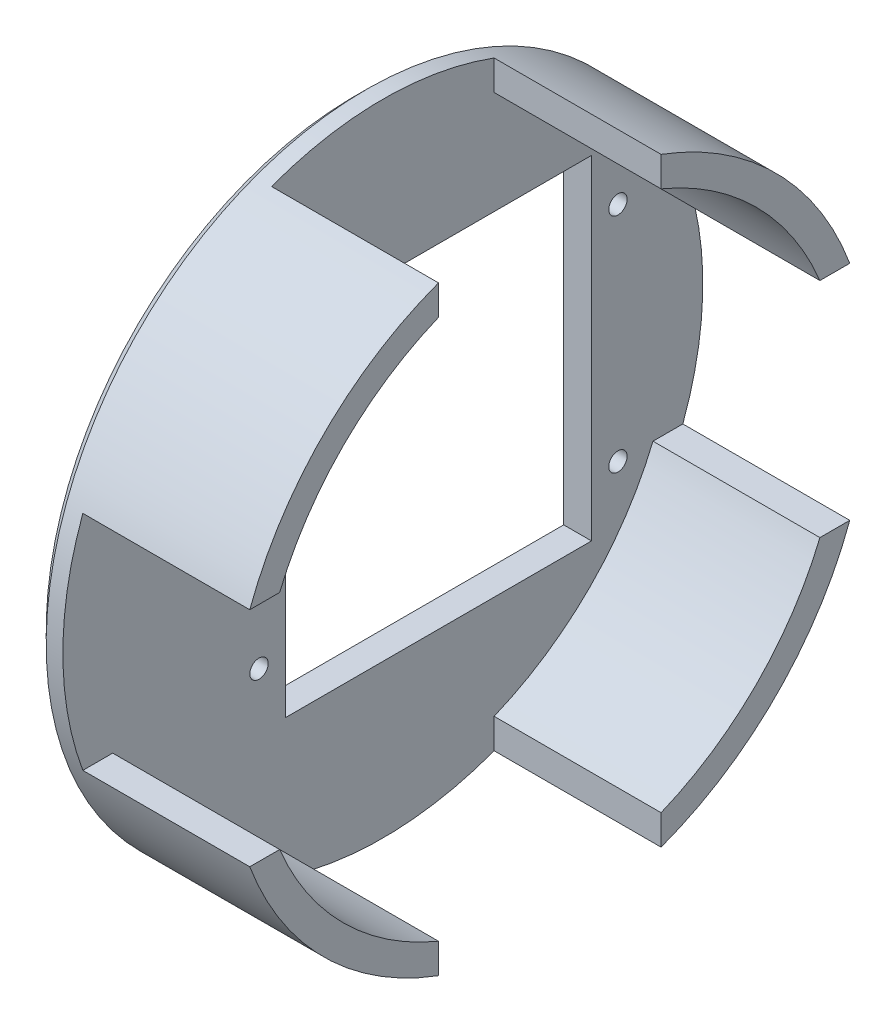
ISO-10303-21;
HEADER;
FILE_DESCRIPTION(('STEP AP214'),'2;1');
FILE_NAME('part.step','',(''),(''),'','','');
FILE_SCHEMA(('AUTOMOTIVE_DESIGN { 1 0 10303 214 1 1 1 1 }'));
ENDSEC;
DATA;
#1=APPLICATION_CONTEXT('core data for automotive mechanical design processes');
#2=APPLICATION_PROTOCOL_DEFINITION('international standard','automotive_design',2000,#1);
#3=PRODUCT_CONTEXT('',#1,'mechanical');
#4=PRODUCT('Part','Part','',(#3));
#5=PRODUCT_RELATED_PRODUCT_CATEGORY('part','',(#4));
#6=PRODUCT_DEFINITION_FORMATION('','',#4);
#7=PRODUCT_DEFINITION_CONTEXT('part definition',#1,'design');
#8=PRODUCT_DEFINITION('design','',#6,#7);
#9=PRODUCT_DEFINITION_SHAPE('','',#8);
#10=(LENGTH_UNIT() NAMED_UNIT(*) SI_UNIT(.MILLI.,.METRE.));
#11=(NAMED_UNIT(*) PLANE_ANGLE_UNIT() SI_UNIT($,.RADIAN.));
#12=(NAMED_UNIT(*) SI_UNIT($,.STERADIAN.) SOLID_ANGLE_UNIT());
#13=UNCERTAINTY_MEASURE_WITH_UNIT(LENGTH_MEASURE(1.E-05),#10,'distance_accuracy_value','');
#14=(GEOMETRIC_REPRESENTATION_CONTEXT(3) GLOBAL_UNCERTAINTY_ASSIGNED_CONTEXT((#13)) GLOBAL_UNIT_ASSIGNED_CONTEXT((#10,
#11,#12)) REPRESENTATION_CONTEXT('',''));
#15=CARTESIAN_POINT('',(0.,0.,0.));
#16=DIRECTION('',(0.,0.,1.));
#17=DIRECTION('',(1.,0.,0.));
#18=AXIS2_PLACEMENT_3D('',#15,#16,#17);
#19=CARTESIAN_POINT('',(5.,0.,0.));
#20=DIRECTION('',(-1.,0.,0.));
#21=DIRECTION('',(0.,0.,1.));
#22=AXIS2_PLACEMENT_3D('',#19,#20,#21);
#23=CYLINDRICAL_SURFACE('',#22,57.5);
#24=CARTESIAN_POINT('',(2.00000000000003,0.,0.));
#25=DIRECTION('',(1.,0.,0.));
#26=DIRECTION('',(0.,0.,-1.));
#27=AXIS2_PLACEMENT_3D('',#24,#25,#26);
#28=CIRCLE('',#27,57.5);
#29=CARTESIAN_POINT('',(2.00000000000003,0.,-57.5));
#30=VERTEX_POINT('',#29);
#31=EDGE_CURVE('E48',#30,#30,#28,.T.);
#32=ORIENTED_EDGE('',*,*,#31,.T.);
#33=EDGE_LOOP('',(#32));
#34=FACE_BOUND('',#33,.T.);
#35=DIRECTION('',(1.,0.,0.));
#36=VECTOR('',#35,1.);
#37=CARTESIAN_POINT('',(5.,20.,53.9096466321196));
#38=LINE('',#37,#36);
#39=CARTESIAN_POINT('',(5.,20.,53.9096466321196));
#40=VERTEX_POINT('',#39);
#41=CARTESIAN_POINT('',(35.,20.,53.9096466321196));
#42=VERTEX_POINT('',#41);
#43=EDGE_CURVE('E177',#40,#42,#38,.T.);
#44=ORIENTED_EDGE('',*,*,#43,.T.);
#45=CARTESIAN_POINT('',(35.,0.,0.));
#46=DIRECTION('',(1.,0.,0.));
#47=DIRECTION('',(0.,0.,-1.));
#48=AXIS2_PLACEMENT_3D('',#45,#46,#47);
#49=CIRCLE('',#48,57.5);
#50=CARTESIAN_POINT('',(35.,53.9096466321196,20.));
#51=VERTEX_POINT('',#50);
#52=EDGE_CURVE('E342',#51,#42,#49,.T.);
#53=ORIENTED_EDGE('',*,*,#52,.F.);
#54=DIRECTION('',(1.,0.,0.));
#55=VECTOR('',#54,1.);
#56=CARTESIAN_POINT('',(5.,53.9096466321196,20.));
#57=LINE('',#56,#55);
#58=CARTESIAN_POINT('',(5.,53.9096466321196,20.));
#59=VERTEX_POINT('',#58);
#60=EDGE_CURVE('E230',#59,#51,#57,.T.);
#61=ORIENTED_EDGE('',*,*,#60,.F.);
#62=CARTESIAN_POINT('',(5.,0.,0.));
#63=DIRECTION('',(1.,0.,0.));
#64=DIRECTION('',(0.,0.,-1.));
#65=AXIS2_PLACEMENT_3D('',#62,#63,#64);
#66=CIRCLE('',#65,57.5);
#67=CARTESIAN_POINT('',(5.,53.9096466321196,-20.));
#68=VERTEX_POINT('',#67);
#69=EDGE_CURVE('E216',#68,#59,#66,.T.);
#70=ORIENTED_EDGE('',*,*,#69,.F.);
#71=DIRECTION('',(1.,0.,0.));
#72=VECTOR('',#71,1.);
#73=CARTESIAN_POINT('',(5.,53.9096466321196,-20.));
#74=LINE('',#73,#72);
#75=CARTESIAN_POINT('',(35.,53.9096466321196,-20.));
#76=VERTEX_POINT('',#75);
#77=EDGE_CURVE('E220',#68,#76,#74,.T.);
#78=ORIENTED_EDGE('',*,*,#77,.T.);
#79=CARTESIAN_POINT('',(35.,20.,-53.9096466321196));
#80=VERTEX_POINT('',#79);
#81=EDGE_CURVE('E338',#80,#76,#49,.T.);
#82=ORIENTED_EDGE('',*,*,#81,.F.);
#83=DIRECTION('',(1.,0.,0.));
#84=VECTOR('',#83,1.);
#85=CARTESIAN_POINT('',(5.,20.,-53.9096466321196));
#86=LINE('',#85,#84);
#87=CARTESIAN_POINT('',(5.,20.,-53.9096466321196));
#88=VERTEX_POINT('',#87);
#89=EDGE_CURVE('E251',#88,#80,#86,.T.);
#90=ORIENTED_EDGE('',*,*,#89,.F.);
#91=CARTESIAN_POINT('',(5.,0.,0.));
#92=DIRECTION('',(1.,0.,0.));
#93=DIRECTION('',(0.,0.,-1.));
#94=AXIS2_PLACEMENT_3D('',#91,#92,#93);
#95=CIRCLE('',#94,57.5);
#96=CARTESIAN_POINT('',(5.,-20.,-53.9096466321196));
#97=VERTEX_POINT('',#96);
#98=EDGE_CURVE('E237',#97,#88,#95,.T.);
#99=ORIENTED_EDGE('',*,*,#98,.F.);
#100=DIRECTION('',(1.,0.,0.));
#101=VECTOR('',#100,1.);
#102=CARTESIAN_POINT('',(5.,-20.,-53.9096466321196));
#103=LINE('',#102,#101);
#104=CARTESIAN_POINT('',(35.,-20.,-53.9096466321196));
#105=VERTEX_POINT('',#104);
#106=EDGE_CURVE('E241',#97,#105,#103,.T.);
#107=ORIENTED_EDGE('',*,*,#106,.T.);
#108=CARTESIAN_POINT('',(35.,-53.9096466321196,-20.));
#109=VERTEX_POINT('',#108);
#110=EDGE_CURVE('E336',#109,#105,#49,.T.);
#111=ORIENTED_EDGE('',*,*,#110,.F.);
#112=DIRECTION('',(1.,0.,0.));
#113=VECTOR('',#112,1.);
#114=CARTESIAN_POINT('',(5.,-53.9096466321196,-20.));
#115=LINE('',#114,#113);
#116=CARTESIAN_POINT('',(5.,-53.9096466321196,-20.));
#117=VERTEX_POINT('',#116);
#118=EDGE_CURVE('E264',#117,#109,#115,.T.);
#119=ORIENTED_EDGE('',*,*,#118,.F.);
#120=CARTESIAN_POINT('',(5.,0.,0.));
#121=DIRECTION('',(1.,0.,0.));
#122=DIRECTION('',(0.,0.,-1.));
#123=AXIS2_PLACEMENT_3D('',#120,#121,#122);
#124=CIRCLE('',#123,57.5);
#125=CARTESIAN_POINT('',(5.,-53.9096466321196,20.));
#126=VERTEX_POINT('',#125);
#127=EDGE_CURVE('E255',#126,#117,#124,.T.);
#128=ORIENTED_EDGE('',*,*,#127,.F.);
#129=DIRECTION('',(1.,0.,0.));
#130=VECTOR('',#129,1.);
#131=CARTESIAN_POINT('',(5.,-53.9096466321196,20.));
#132=LINE('',#131,#130);
#133=CARTESIAN_POINT('',(35.,-53.9096466321196,20.));
#134=VERTEX_POINT('',#133);
#135=EDGE_CURVE('E244',#126,#134,#132,.T.);
#136=ORIENTED_EDGE('',*,*,#135,.T.);
#137=CARTESIAN_POINT('',(35.,-20.0000000000001,53.9096466321195));
#138=VERTEX_POINT('',#137);
#139=EDGE_CURVE('E642',#138,#134,#49,.T.);
#140=ORIENTED_EDGE('',*,*,#139,.F.);
#141=DIRECTION('',(1.,0.,0.));
#142=VECTOR('',#141,1.);
#143=CARTESIAN_POINT('',(5.,-20.0000000000001,53.9096466321195));
#144=LINE('',#143,#142);
#145=CARTESIAN_POINT('',(5.,-20.0000000000001,53.9096466321195));
#146=VERTEX_POINT('',#145);
#147=EDGE_CURVE('E188',#146,#138,#144,.T.);
#148=ORIENTED_EDGE('',*,*,#147,.F.);
#149=CARTESIAN_POINT('',(5.,0.,0.));
#150=DIRECTION('',(1.,0.,0.));
#151=DIRECTION('',(0.,0.,-1.));
#152=AXIS2_PLACEMENT_3D('',#149,#150,#151);
#153=CIRCLE('',#152,57.5);
#154=EDGE_CURVE('E194',#40,#146,#153,.T.);
#155=ORIENTED_EDGE('',*,*,#154,.F.);
#156=EDGE_LOOP('',(#44,#53,#61,#70,#78,#82,#90,#99,#107,#111,#119,#128,#136,#140,#148,#155));
#157=FACE_BOUND('',#156,.T.);
#158=ADVANCED_FACE('F39',(#34,#157),#23,.T.);
#159=CARTESIAN_POINT('',(35.,0.,0.));
#160=DIRECTION('',(1.,0.,0.));
#161=DIRECTION('',(0.,0.,-1.));
#162=AXIS2_PLACEMENT_3D('',#159,#160,#161);
#163=PLANE('',#162);
#164=ORIENTED_EDGE('',*,*,#52,.T.);
#165=DIRECTION('',(0.,0.,-1.));
#166=VECTOR('',#165,1.);
#167=CARTESIAN_POINT('',(35.,20.,0.));
#168=LINE('',#167,#166);
#169=CARTESIAN_POINT('',(35.,20.,48.541219597369));
#170=VERTEX_POINT('',#169);
#171=EDGE_CURVE('E183',#42,#170,#168,.T.);
#172=ORIENTED_EDGE('',*,*,#171,.T.);
#173=CARTESIAN_POINT('',(35.,0.,0.));
#174=DIRECTION('',(1.,0.,0.));
#175=DIRECTION('',(0.,0.,-1.));
#176=AXIS2_PLACEMENT_3D('',#173,#174,#175);
#177=CIRCLE('',#176,52.5);
#178=CARTESIAN_POINT('',(35.,48.541219597369,20.));
#179=VERTEX_POINT('',#178);
#180=EDGE_CURVE('E337',#179,#170,#177,.T.);
#181=ORIENTED_EDGE('',*,*,#180,.F.);
#182=DIRECTION('',(0.,-1.,0.));
#183=VECTOR('',#182,1.);
#184=CARTESIAN_POINT('',(35.,0.,20.));
#185=LINE('',#184,#183);
#186=EDGE_CURVE('E217',#51,#179,#185,.T.);
#187=ORIENTED_EDGE('',*,*,#186,.F.);
#188=EDGE_LOOP('',(#164,#172,#181,#187));
#189=FACE_BOUND('',#188,.T.);
#190=ADVANCED_FACE('F360',(#189),#163,.T.);
#191=ORIENTED_EDGE('',*,*,#81,.T.);
#192=DIRECTION('',(0.,-1.,0.));
#193=VECTOR('',#192,1.);
#194=CARTESIAN_POINT('',(35.,0.,-20.));
#195=LINE('',#194,#193);
#196=CARTESIAN_POINT('',(35.,48.541219597369,-20.));
#197=VERTEX_POINT('',#196);
#198=EDGE_CURVE('E221',#76,#197,#195,.T.);
#199=ORIENTED_EDGE('',*,*,#198,.T.);
#200=CARTESIAN_POINT('',(35.,20.,-48.541219597369));
#201=VERTEX_POINT('',#200);
#202=EDGE_CURVE('E333',#201,#197,#177,.T.);
#203=ORIENTED_EDGE('',*,*,#202,.F.);
#204=DIRECTION('',(0.,0.,-1.));
#205=VECTOR('',#204,1.);
#206=CARTESIAN_POINT('',(35.,20.,0.));
#207=LINE('',#206,#205);
#208=EDGE_CURVE('E238',#201,#80,#207,.T.);
#209=ORIENTED_EDGE('',*,*,#208,.T.);
#210=EDGE_LOOP('',(#191,#199,#203,#209));
#211=FACE_BOUND('',#210,.T.);
#212=ADVANCED_FACE('F364',(#211),#163,.T.);
#213=DIRECTION('',(0.,0.,-1.));
#214=VECTOR('',#213,1.);
#215=CARTESIAN_POINT('',(35.,-20.,0.));
#216=LINE('',#215,#214);
#217=CARTESIAN_POINT('',(35.,-20.,48.541219597369));
#218=VERTEX_POINT('',#217);
#219=EDGE_CURVE('E198',#138,#218,#216,.T.);
#220=ORIENTED_EDGE('',*,*,#219,.F.);
#221=ORIENTED_EDGE('',*,*,#139,.T.);
#222=DIRECTION('',(0.,-1.,0.));
#223=VECTOR('',#222,1.);
#224=CARTESIAN_POINT('',(35.,0.,20.));
#225=LINE('',#224,#223);
#226=CARTESIAN_POINT('',(35.,-48.541219597369,20.));
#227=VERTEX_POINT('',#226);
#228=EDGE_CURVE('E259',#227,#134,#225,.T.);
#229=ORIENTED_EDGE('',*,*,#228,.F.);
#230=EDGE_CURVE('E643',#218,#227,#177,.T.);
#231=ORIENTED_EDGE('',*,*,#230,.F.);
#232=EDGE_LOOP('',(#220,#221,#229,#231));
#233=FACE_BOUND('',#232,.T.);
#234=ADVANCED_FACE('F381',(#233),#163,.T.);
#235=CARTESIAN_POINT('',(35.,0.,0.));
#236=DIRECTION('',(-1.,0.,0.));
#237=DIRECTION('',(0.,0.,1.));
#238=AXIS2_PLACEMENT_3D('',#235,#236,#237);
#239=CYLINDRICAL_SURFACE('',#238,52.5);
#240=ORIENTED_EDGE('',*,*,#180,.T.);
#241=DIRECTION('',(1.,0.,0.));
#242=VECTOR('',#241,1.);
#243=CARTESIAN_POINT('',(5.,20.,48.541219597369));
#244=LINE('',#243,#242);
#245=CARTESIAN_POINT('',(5.,20.,48.541219597369));
#246=VERTEX_POINT('',#245);
#247=EDGE_CURVE('E207',#246,#170,#244,.T.);
#248=ORIENTED_EDGE('',*,*,#247,.F.);
#249=CARTESIAN_POINT('',(5.,0.,0.));
#250=DIRECTION('',(1.,0.,0.));
#251=DIRECTION('',(0.,0.,-1.));
#252=AXIS2_PLACEMENT_3D('',#249,#250,#251);
#253=CIRCLE('',#252,52.5);
#254=CARTESIAN_POINT('',(5.,48.541219597369,20.));
#255=VERTEX_POINT('',#254);
#256=EDGE_CURVE('E197',#246,#255,#253,.F.);
#257=ORIENTED_EDGE('',*,*,#256,.T.);
#258=DIRECTION('',(1.,0.,0.));
#259=VECTOR('',#258,1.);
#260=CARTESIAN_POINT('',(5.,48.541219597369,20.));
#261=LINE('',#260,#259);
#262=EDGE_CURVE('E227',#255,#179,#261,.T.);
#263=ORIENTED_EDGE('',*,*,#262,.T.);
#264=EDGE_LOOP('',(#240,#248,#257,#263));
#265=FACE_BOUND('',#264,.T.);
#266=ADVANCED_FACE('F385',(#265),#239,.F.);
#267=ORIENTED_EDGE('',*,*,#202,.T.);
#268=DIRECTION('',(1.,0.,0.));
#269=VECTOR('',#268,1.);
#270=CARTESIAN_POINT('',(5.,48.541219597369,-20.));
#271=LINE('',#270,#269);
#272=CARTESIAN_POINT('',(5.,48.541219597369,-20.));
#273=VERTEX_POINT('',#272);
#274=EDGE_CURVE('E205',#273,#197,#271,.T.);
#275=ORIENTED_EDGE('',*,*,#274,.F.);
#276=CARTESIAN_POINT('',(5.,20.,-48.541219597369));
#277=VERTEX_POINT('',#276);
#278=EDGE_CURVE('E341',#273,#277,#253,.F.);
#279=ORIENTED_EDGE('',*,*,#278,.T.);
#280=DIRECTION('',(1.,0.,0.));
#281=VECTOR('',#280,1.);
#282=CARTESIAN_POINT('',(5.,20.,-48.541219597369));
#283=LINE('',#282,#281);
#284=EDGE_CURVE('E248',#277,#201,#283,.T.);
#285=ORIENTED_EDGE('',*,*,#284,.T.);
#286=EDGE_LOOP('',(#267,#275,#279,#285));
#287=FACE_BOUND('',#286,.T.);
#288=ADVANCED_FACE('F583',(#287),#239,.F.);
#289=DIRECTION('',(1.,0.,0.));
#290=VECTOR('',#289,1.);
#291=CARTESIAN_POINT('',(5.,-20.,48.541219597369));
#292=LINE('',#291,#290);
#293=CARTESIAN_POINT('',(5.,-20.,48.541219597369));
#294=VERTEX_POINT('',#293);
#295=EDGE_CURVE('E210',#294,#218,#292,.T.);
#296=ORIENTED_EDGE('',*,*,#295,.T.);
#297=ORIENTED_EDGE('',*,*,#230,.T.);
#298=DIRECTION('',(1.,0.,0.));
#299=VECTOR('',#298,1.);
#300=CARTESIAN_POINT('',(5.,-48.541219597369,20.));
#301=LINE('',#300,#299);
#302=CARTESIAN_POINT('',(5.,-48.541219597369,20.));
#303=VERTEX_POINT('',#302);
#304=EDGE_CURVE('E271',#303,#227,#301,.T.);
#305=ORIENTED_EDGE('',*,*,#304,.F.);
#306=EDGE_CURVE('E345',#303,#294,#253,.F.);
#307=ORIENTED_EDGE('',*,*,#306,.T.);
#308=EDGE_LOOP('',(#296,#297,#305,#307));
#309=FACE_BOUND('',#308,.T.);
#310=ADVANCED_FACE('F372',(#309),#239,.F.);
#311=CARTESIAN_POINT('',(0.,0.,0.));
#312=DIRECTION('',(1.,0.,0.));
#313=DIRECTION('',(0.,0.,-1.));
#314=AXIS2_PLACEMENT_3D('',#311,#312,#313);
#315=PLANE('',#314);
#316=CARTESIAN_POINT('',(0.,0.,0.));
#317=DIRECTION('',(1.,0.,0.));
#318=DIRECTION('',(0.,0.,-1.));
#319=AXIS2_PLACEMENT_3D('',#316,#317,#318);
#320=CIRCLE('',#319,55.5);
#321=CARTESIAN_POINT('',(0.,0.,-55.5));
#322=VERTEX_POINT('',#321);
#323=EDGE_CURVE('E11',#322,#322,#320,.F.);
#324=ORIENTED_EDGE('',*,*,#323,.T.);
#325=EDGE_LOOP('',(#324));
#326=FACE_BOUND('',#325,.T.);
#327=CARTESIAN_POINT('',(0.,-20.,22.25));
#328=DIRECTION('',(1.,0.,0.));
#329=DIRECTION('',(0.,0.,1.));
#330=AXIS2_PLACEMENT_3D('',#327,#328,#329);
#331=CIRCLE('',#330,1.65);
#332=CARTESIAN_POINT('',(0.,-20.,23.9));
#333=VERTEX_POINT('',#332);
#334=EDGE_CURVE('E315',#333,#333,#331,.T.);
#335=ORIENTED_EDGE('',*,*,#334,.T.);
#336=EDGE_LOOP('',(#335));
#337=FACE_BOUND('',#336,.T.);
#338=CARTESIAN_POINT('',(0.,20.,-42.25));
#339=DIRECTION('',(1.,0.,0.));
#340=DIRECTION('',(0.,0.,1.));
#341=AXIS2_PLACEMENT_3D('',#338,#339,#340);
#342=CIRCLE('',#341,1.65);
#343=CARTESIAN_POINT('',(0.,20.,-40.6));
#344=VERTEX_POINT('',#343);
#345=EDGE_CURVE('E322',#344,#344,#342,.T.);
#346=ORIENTED_EDGE('',*,*,#345,.T.);
#347=EDGE_LOOP('',(#346));
#348=FACE_BOUND('',#347,.T.);
#349=CARTESIAN_POINT('',(0.,-20.,-42.25));
#350=DIRECTION('',(1.,0.,0.));
#351=DIRECTION('',(0.,0.,-1.));
#352=AXIS2_PLACEMENT_3D('',#349,#350,#351);
#353=CIRCLE('',#352,1.65);
#354=CARTESIAN_POINT('',(0.,-20.,-43.9));
#355=VERTEX_POINT('',#354);
#356=EDGE_CURVE('E277',#355,#355,#353,.T.);
#357=ORIENTED_EDGE('',*,*,#356,.T.);
#358=EDGE_LOOP('',(#357));
#359=FACE_BOUND('',#358,.T.);
#360=DIRECTION('',(0.,0.,-1.));
#361=VECTOR('',#360,1.);
#362=CARTESIAN_POINT('',(0.,-30.,17.5));
#363=LINE('',#362,#361);
#364=CARTESIAN_POINT('',(0.,-30.,17.5));
#365=VERTEX_POINT('',#364);
#366=CARTESIAN_POINT('',(0.,-30.,-37.5));
#367=VERTEX_POINT('',#366);
#368=EDGE_CURVE('E295',#365,#367,#363,.T.);
#369=ORIENTED_EDGE('',*,*,#368,.T.);
#370=DIRECTION('',(0.,1.,0.));
#371=VECTOR('',#370,1.);
#372=CARTESIAN_POINT('',(0.,30.,-37.5));
#373=LINE('',#372,#371);
#374=CARTESIAN_POINT('',(0.,30.,-37.5));
#375=VERTEX_POINT('',#374);
#376=EDGE_CURVE('E285',#367,#375,#373,.T.);
#377=ORIENTED_EDGE('',*,*,#376,.T.);
#378=DIRECTION('',(0.,0.,1.));
#379=VECTOR('',#378,1.);
#380=CARTESIAN_POINT('',(0.,30.,17.5));
#381=LINE('',#380,#379);
#382=CARTESIAN_POINT('',(0.,30.,17.5));
#383=VERTEX_POINT('',#382);
#384=EDGE_CURVE('E288',#375,#383,#381,.T.);
#385=ORIENTED_EDGE('',*,*,#384,.T.);
#386=DIRECTION('',(0.,-1.,0.));
#387=VECTOR('',#386,1.);
#388=CARTESIAN_POINT('',(0.,30.,17.5));
#389=LINE('',#388,#387);
#390=EDGE_CURVE('E292',#383,#365,#389,.T.);
#391=ORIENTED_EDGE('',*,*,#390,.T.);
#392=EDGE_LOOP('',(#369,#377,#385,#391));
#393=FACE_BOUND('',#392,.T.);
#394=CARTESIAN_POINT('',(0.,20.,22.25));
#395=DIRECTION('',(1.,0.,0.));
#396=DIRECTION('',(0.,0.,-1.));
#397=AXIS2_PLACEMENT_3D('',#394,#395,#396);
#398=CIRCLE('',#397,1.65);
#399=CARTESIAN_POINT('',(0.,20.,20.6));
#400=VERTEX_POINT('',#399);
#401=EDGE_CURVE('E327',#400,#400,#398,.T.);
#402=ORIENTED_EDGE('',*,*,#401,.T.);
#403=EDGE_LOOP('',(#402));
#404=FACE_BOUND('',#403,.T.);
#405=ADVANCED_FACE('F369',(#326,#337,#348,#359,#393,#404),#315,.F.);
#406=DIRECTION('',(0.,0.,-1.));
#407=VECTOR('',#406,1.);
#408=CARTESIAN_POINT('',(35.,-20.,0.));
#409=LINE('',#408,#407);
#410=CARTESIAN_POINT('',(35.,-20.,-48.541219597369));
#411=VERTEX_POINT('',#410);
#412=EDGE_CURVE('E242',#411,#105,#409,.T.);
#413=ORIENTED_EDGE('',*,*,#412,.F.);
#414=CARTESIAN_POINT('',(35.,-48.541219597369,-20.));
#415=VERTEX_POINT('',#414);
#416=EDGE_CURVE('E330',#415,#411,#177,.T.);
#417=ORIENTED_EDGE('',*,*,#416,.F.);
#418=DIRECTION('',(0.,-1.,0.));
#419=VECTOR('',#418,1.);
#420=CARTESIAN_POINT('',(35.,0.,-20.));
#421=LINE('',#420,#419);
#422=EDGE_CURVE('E265',#415,#109,#421,.T.);
#423=ORIENTED_EDGE('',*,*,#422,.T.);
#424=ORIENTED_EDGE('',*,*,#110,.T.);
#425=EDGE_LOOP('',(#413,#417,#423,#424));
#426=FACE_BOUND('',#425,.T.);
#427=ADVANCED_FACE('F367',(#426),#163,.T.);
#428=DIRECTION('',(1.,0.,0.));
#429=VECTOR('',#428,1.);
#430=CARTESIAN_POINT('',(5.,-20.,-48.541219597369));
#431=LINE('',#430,#429);
#432=CARTESIAN_POINT('',(5.,-20.,-48.541219597369));
#433=VERTEX_POINT('',#432);
#434=EDGE_CURVE('E224',#433,#411,#431,.T.);
#435=ORIENTED_EDGE('',*,*,#434,.F.);
#436=CARTESIAN_POINT('',(5.,-48.541219597369,-20.));
#437=VERTEX_POINT('',#436);
#438=EDGE_CURVE('E343',#433,#437,#253,.F.);
#439=ORIENTED_EDGE('',*,*,#438,.T.);
#440=DIRECTION('',(1.,0.,0.));
#441=VECTOR('',#440,1.);
#442=CARTESIAN_POINT('',(5.,-48.541219597369,-20.));
#443=LINE('',#442,#441);
#444=EDGE_CURVE('E273',#437,#415,#443,.T.);
#445=ORIENTED_EDGE('',*,*,#444,.T.);
#446=ORIENTED_EDGE('',*,*,#416,.T.);
#447=EDGE_LOOP('',(#435,#439,#445,#446));
#448=FACE_BOUND('',#447,.T.);
#449=ADVANCED_FACE('F376',(#448),#239,.F.);
#450=CARTESIAN_POINT('',(5.,0.,0.));
#451=DIRECTION('',(1.,0.,0.));
#452=DIRECTION('',(0.,0.,-1.));
#453=AXIS2_PLACEMENT_3D('',#450,#451,#452);
#454=PLANE('',#453);
#455=DIRECTION('',(0.,1.,0.));
#456=VECTOR('',#455,1.);
#457=CARTESIAN_POINT('',(5.,30.,-37.5));
#458=LINE('',#457,#456);
#459=CARTESIAN_POINT('',(5.,-30.,-37.5));
#460=VERTEX_POINT('',#459);
#461=CARTESIAN_POINT('',(5.,30.,-37.5));
#462=VERTEX_POINT('',#461);
#463=EDGE_CURVE('E209',#460,#462,#458,.T.);
#464=ORIENTED_EDGE('',*,*,#463,.F.);
#465=DIRECTION('',(0.,0.,-1.));
#466=VECTOR('',#465,1.);
#467=CARTESIAN_POINT('',(5.,-30.,17.5));
#468=LINE('',#467,#466);
#469=CARTESIAN_POINT('',(5.,-30.,17.5));
#470=VERTEX_POINT('',#469);
#471=EDGE_CURVE('E289',#470,#460,#468,.T.);
#472=ORIENTED_EDGE('',*,*,#471,.F.);
#473=DIRECTION('',(0.,-1.,0.));
#474=VECTOR('',#473,1.);
#475=CARTESIAN_POINT('',(5.,30.,17.5));
#476=LINE('',#475,#474);
#477=CARTESIAN_POINT('',(5.,30.,17.5));
#478=VERTEX_POINT('',#477);
#479=EDGE_CURVE('E304',#478,#470,#476,.T.);
#480=ORIENTED_EDGE('',*,*,#479,.F.);
#481=DIRECTION('',(0.,0.,1.));
#482=VECTOR('',#481,1.);
#483=CARTESIAN_POINT('',(5.,30.,17.5));
#484=LINE('',#483,#482);
#485=EDGE_CURVE('E301',#462,#478,#484,.T.);
#486=ORIENTED_EDGE('',*,*,#485,.F.);
#487=EDGE_LOOP('',(#464,#472,#480,#486));
#488=FACE_BOUND('',#487,.T.);
#489=CARTESIAN_POINT('',(5.,-20.,22.25));
#490=DIRECTION('',(1.,0.,0.));
#491=DIRECTION('',(0.,0.,1.));
#492=AXIS2_PLACEMENT_3D('',#489,#490,#491);
#493=CIRCLE('',#492,1.65);
#494=CARTESIAN_POINT('',(5.,-20.,23.9));
#495=VERTEX_POINT('',#494);
#496=EDGE_CURVE('E319',#495,#495,#493,.T.);
#497=ORIENTED_EDGE('',*,*,#496,.F.);
#498=EDGE_LOOP('',(#497));
#499=FACE_BOUND('',#498,.T.);
#500=CARTESIAN_POINT('',(5.,20.,-42.25));
#501=DIRECTION('',(1.,0.,0.));
#502=DIRECTION('',(0.,0.,1.));
#503=AXIS2_PLACEMENT_3D('',#500,#501,#502);
#504=CIRCLE('',#503,1.65);
#505=CARTESIAN_POINT('',(5.,20.,-40.6));
#506=VERTEX_POINT('',#505);
#507=EDGE_CURVE('E280',#506,#506,#504,.T.);
#508=ORIENTED_EDGE('',*,*,#507,.F.);
#509=EDGE_LOOP('',(#508));
#510=FACE_BOUND('',#509,.T.);
#511=CARTESIAN_POINT('',(5.,-20.,-42.25));
#512=DIRECTION('',(1.,0.,0.));
#513=DIRECTION('',(0.,0.,-1.));
#514=AXIS2_PLACEMENT_3D('',#511,#512,#513);
#515=CIRCLE('',#514,1.65);
#516=CARTESIAN_POINT('',(5.,-20.,-43.9));
#517=VERTEX_POINT('',#516);
#518=EDGE_CURVE('E281',#517,#517,#515,.T.);
#519=ORIENTED_EDGE('',*,*,#518,.F.);
#520=EDGE_LOOP('',(#519));
#521=FACE_BOUND('',#520,.T.);
#522=CARTESIAN_POINT('',(5.,20.,22.25));
#523=DIRECTION('',(1.,0.,0.));
#524=DIRECTION('',(0.,0.,-1.));
#525=AXIS2_PLACEMENT_3D('',#522,#523,#524);
#526=CIRCLE('',#525,1.65);
#527=CARTESIAN_POINT('',(5.,20.,20.6));
#528=VERTEX_POINT('',#527);
#529=EDGE_CURVE('E318',#528,#528,#526,.T.);
#530=ORIENTED_EDGE('',*,*,#529,.F.);
#531=EDGE_LOOP('',(#530));
#532=FACE_BOUND('',#531,.T.);
#533=ORIENTED_EDGE('',*,*,#438,.F.);
#534=DIRECTION('',(0.,0.,-1.));
#535=VECTOR('',#534,1.);
#536=CARTESIAN_POINT('',(5.,-20.,0.));
#537=LINE('',#536,#535);
#538=EDGE_CURVE('E234',#433,#97,#537,.T.);
#539=ORIENTED_EDGE('',*,*,#538,.T.);
#540=ORIENTED_EDGE('',*,*,#98,.T.);
#541=DIRECTION('',(0.,0.,-1.));
#542=VECTOR('',#541,1.);
#543=CARTESIAN_POINT('',(5.,20.,0.));
#544=LINE('',#543,#542);
#545=EDGE_CURVE('E55',#277,#88,#544,.T.);
#546=ORIENTED_EDGE('',*,*,#545,.F.);
#547=ORIENTED_EDGE('',*,*,#278,.F.);
#548=DIRECTION('',(0.,-1.,0.));
#549=VECTOR('',#548,1.);
#550=CARTESIAN_POINT('',(5.,0.,-20.));
#551=LINE('',#550,#549);
#552=EDGE_CURVE('E214',#68,#273,#551,.T.);
#553=ORIENTED_EDGE('',*,*,#552,.F.);
#554=ORIENTED_EDGE('',*,*,#69,.T.);
#555=DIRECTION('',(0.,-1.,0.));
#556=VECTOR('',#555,1.);
#557=CARTESIAN_POINT('',(5.,0.,20.));
#558=LINE('',#557,#556);
#559=EDGE_CURVE('E62',#59,#255,#558,.T.);
#560=ORIENTED_EDGE('',*,*,#559,.T.);
#561=ORIENTED_EDGE('',*,*,#256,.F.);
#562=DIRECTION('',(0.,0.,-1.));
#563=VECTOR('',#562,1.);
#564=CARTESIAN_POINT('',(5.,20.,0.));
#565=LINE('',#564,#563);
#566=EDGE_CURVE('E180',#40,#246,#565,.T.);
#567=ORIENTED_EDGE('',*,*,#566,.F.);
#568=ORIENTED_EDGE('',*,*,#154,.T.);
#569=DIRECTION('',(0.,0.,-1.));
#570=VECTOR('',#569,1.);
#571=CARTESIAN_POINT('',(5.,-20.,0.));
#572=LINE('',#571,#570);
#573=EDGE_CURVE('E189',#146,#294,#572,.T.);
#574=ORIENTED_EDGE('',*,*,#573,.T.);
#575=ORIENTED_EDGE('',*,*,#306,.F.);
#576=DIRECTION('',(0.,-1.,0.));
#577=VECTOR('',#576,1.);
#578=CARTESIAN_POINT('',(5.,0.,20.));
#579=LINE('',#578,#577);
#580=EDGE_CURVE('E261',#303,#126,#579,.T.);
#581=ORIENTED_EDGE('',*,*,#580,.T.);
#582=ORIENTED_EDGE('',*,*,#127,.T.);
#583=DIRECTION('',(0.,-1.,0.));
#584=VECTOR('',#583,1.);
#585=CARTESIAN_POINT('',(5.,0.,-20.));
#586=LINE('',#585,#584);
#587=EDGE_CURVE('E258',#437,#117,#586,.T.);
#588=ORIENTED_EDGE('',*,*,#587,.F.);
#589=EDGE_LOOP('',(#533,#539,#540,#546,#547,#553,#554,#560,#561,#567,#568,#574,#575,#581,#582,#588));
#590=FACE_BOUND('',#589,.T.);
#591=ADVANCED_FACE('F193',(#488,#499,#510,#521,#532,#590),#454,.T.);
#592=CARTESIAN_POINT('',(0.,20.,22.25));
#593=DIRECTION('',(1.,0.,0.));
#594=DIRECTION('',(0.,0.,-1.));
#595=AXIS2_PLACEMENT_3D('',#592,#593,#594);
#596=CYLINDRICAL_SURFACE('',#595,1.65);
#597=ORIENTED_EDGE('',*,*,#401,.F.);
#598=EDGE_LOOP('',(#597));
#599=FACE_BOUND('',#598,.T.);
#600=ORIENTED_EDGE('',*,*,#529,.T.);
#601=EDGE_LOOP('',(#600));
#602=FACE_BOUND('',#601,.T.);
#603=ADVANCED_FACE('F375',(#599,#602),#596,.F.);
#604=CARTESIAN_POINT('',(0.,-20.,-42.25));
#605=DIRECTION('',(1.,0.,0.));
#606=DIRECTION('',(0.,0.,-1.));
#607=AXIS2_PLACEMENT_3D('',#604,#605,#606);
#608=CYLINDRICAL_SURFACE('',#607,1.65);
#609=ORIENTED_EDGE('',*,*,#356,.F.);
#610=EDGE_LOOP('',(#609));
#611=FACE_BOUND('',#610,.T.);
#612=ORIENTED_EDGE('',*,*,#518,.T.);
#613=EDGE_LOOP('',(#612));
#614=FACE_BOUND('',#613,.T.);
#615=ADVANCED_FACE('F388',(#611,#614),#608,.F.);
#616=CARTESIAN_POINT('',(0.,20.,-42.25));
#617=DIRECTION('',(1.,0.,0.));
#618=DIRECTION('',(0.,0.,-1.));
#619=AXIS2_PLACEMENT_3D('',#616,#617,#618);
#620=CYLINDRICAL_SURFACE('',#619,1.65);
#621=ORIENTED_EDGE('',*,*,#345,.F.);
#622=EDGE_LOOP('',(#621));
#623=FACE_BOUND('',#622,.T.);
#624=ORIENTED_EDGE('',*,*,#507,.T.);
#625=EDGE_LOOP('',(#624));
#626=FACE_BOUND('',#625,.T.);
#627=ADVANCED_FACE('F390',(#623,#626),#620,.F.);
#628=CARTESIAN_POINT('',(0.,-20.,22.25));
#629=DIRECTION('',(1.,0.,0.));
#630=DIRECTION('',(0.,0.,-1.));
#631=AXIS2_PLACEMENT_3D('',#628,#629,#630);
#632=CYLINDRICAL_SURFACE('',#631,1.65);
#633=ORIENTED_EDGE('',*,*,#334,.F.);
#634=EDGE_LOOP('',(#633));
#635=FACE_BOUND('',#634,.T.);
#636=ORIENTED_EDGE('',*,*,#496,.T.);
#637=EDGE_LOOP('',(#636));
#638=FACE_BOUND('',#637,.T.);
#639=ADVANCED_FACE('F393',(#635,#638),#632,.F.);
#640=CARTESIAN_POINT('',(0.,30.,-37.5));
#641=DIRECTION('',(0.,0.,-1.));
#642=DIRECTION('',(0.,1.,0.));
#643=AXIS2_PLACEMENT_3D('',#640,#641,#642);
#644=PLANE('',#643);
#645=ORIENTED_EDGE('',*,*,#463,.T.);
#646=DIRECTION('',(1.,0.,0.));
#647=VECTOR('',#646,1.);
#648=CARTESIAN_POINT('',(0.,30.,-37.5));
#649=LINE('',#648,#647);
#650=EDGE_CURVE('E298',#375,#462,#649,.T.);
#651=ORIENTED_EDGE('',*,*,#650,.F.);
#652=ORIENTED_EDGE('',*,*,#376,.F.);
#653=DIRECTION('',(1.,0.,0.));
#654=VECTOR('',#653,1.);
#655=CARTESIAN_POINT('',(0.,-30.,-37.5));
#656=LINE('',#655,#654);
#657=EDGE_CURVE('E284',#367,#460,#656,.T.);
#658=ORIENTED_EDGE('',*,*,#657,.T.);
#659=EDGE_LOOP('',(#645,#651,#652,#658));
#660=FACE_BOUND('',#659,.T.);
#661=ADVANCED_FACE('F397',(#660),#644,.F.);
#662=CARTESIAN_POINT('',(0.,-30.,17.5));
#663=DIRECTION('',(0.,-1.,0.));
#664=DIRECTION('',(0.,0.,-1.));
#665=AXIS2_PLACEMENT_3D('',#662,#663,#664);
#666=PLANE('',#665);
#667=ORIENTED_EDGE('',*,*,#471,.T.);
#668=ORIENTED_EDGE('',*,*,#657,.F.);
#669=ORIENTED_EDGE('',*,*,#368,.F.);
#670=DIRECTION('',(1.,0.,0.));
#671=VECTOR('',#670,1.);
#672=CARTESIAN_POINT('',(0.,-30.,17.5));
#673=LINE('',#672,#671);
#674=EDGE_CURVE('E309',#365,#470,#673,.T.);
#675=ORIENTED_EDGE('',*,*,#674,.T.);
#676=EDGE_LOOP('',(#667,#668,#669,#675));
#677=FACE_BOUND('',#676,.T.);
#678=ADVANCED_FACE('F401',(#677),#666,.F.);
#679=CARTESIAN_POINT('',(0.,30.,17.5));
#680=DIRECTION('',(0.,0.,1.));
#681=DIRECTION('',(0.,-1.,0.));
#682=AXIS2_PLACEMENT_3D('',#679,#680,#681);
#683=PLANE('',#682);
#684=ORIENTED_EDGE('',*,*,#479,.T.);
#685=ORIENTED_EDGE('',*,*,#674,.F.);
#686=ORIENTED_EDGE('',*,*,#390,.F.);
#687=DIRECTION('',(1.,0.,0.));
#688=VECTOR('',#687,1.);
#689=CARTESIAN_POINT('',(0.,30.,17.5));
#690=LINE('',#689,#688);
#691=EDGE_CURVE('E312',#383,#478,#690,.T.);
#692=ORIENTED_EDGE('',*,*,#691,.T.);
#693=EDGE_LOOP('',(#684,#685,#686,#692));
#694=FACE_BOUND('',#693,.T.);
#695=ADVANCED_FACE('F407',(#694),#683,.F.);
#696=CARTESIAN_POINT('',(0.,30.,17.5));
#697=DIRECTION('',(0.,1.,0.));
#698=DIRECTION('',(0.,0.,1.));
#699=AXIS2_PLACEMENT_3D('',#696,#697,#698);
#700=PLANE('',#699);
#701=ORIENTED_EDGE('',*,*,#485,.T.);
#702=ORIENTED_EDGE('',*,*,#691,.F.);
#703=ORIENTED_EDGE('',*,*,#384,.F.);
#704=ORIENTED_EDGE('',*,*,#650,.T.);
#705=EDGE_LOOP('',(#701,#702,#703,#704));
#706=FACE_BOUND('',#705,.T.);
#707=ADVANCED_FACE('F403',(#706),#700,.F.);
#708=CARTESIAN_POINT('',(5.,0.,20.));
#709=DIRECTION('',(0.,0.,1.));
#710=DIRECTION('',(1.,0.,0.));
#711=AXIS2_PLACEMENT_3D('',#708,#709,#710);
#712=PLANE('',#711);
#713=ORIENTED_EDGE('',*,*,#228,.T.);
#714=ORIENTED_EDGE('',*,*,#135,.F.);
#715=ORIENTED_EDGE('',*,*,#580,.F.);
#716=ORIENTED_EDGE('',*,*,#304,.T.);
#717=EDGE_LOOP('',(#713,#714,#715,#716));
#718=FACE_BOUND('',#717,.T.);
#719=ADVANCED_FACE('F406',(#718),#712,.F.);
#720=CARTESIAN_POINT('',(5.,0.,-20.));
#721=DIRECTION('',(0.,0.,1.));
#722=DIRECTION('',(1.,0.,0.));
#723=AXIS2_PLACEMENT_3D('',#720,#721,#722);
#724=PLANE('',#723);
#725=ORIENTED_EDGE('',*,*,#422,.F.);
#726=ORIENTED_EDGE('',*,*,#444,.F.);
#727=ORIENTED_EDGE('',*,*,#587,.T.);
#728=ORIENTED_EDGE('',*,*,#118,.T.);
#729=EDGE_LOOP('',(#725,#726,#727,#728));
#730=FACE_BOUND('',#729,.T.);
#731=ADVANCED_FACE('F418',(#730),#724,.T.);
#732=CARTESIAN_POINT('',(5.,-20.,0.));
#733=DIRECTION('',(0.,-1.,0.));
#734=DIRECTION('',(0.,0.,-1.));
#735=AXIS2_PLACEMENT_3D('',#732,#733,#734);
#736=PLANE('',#735);
#737=ORIENTED_EDGE('',*,*,#412,.T.);
#738=ORIENTED_EDGE('',*,*,#106,.F.);
#739=ORIENTED_EDGE('',*,*,#538,.F.);
#740=ORIENTED_EDGE('',*,*,#434,.T.);
#741=EDGE_LOOP('',(#737,#738,#739,#740));
#742=FACE_BOUND('',#741,.T.);
#743=ADVANCED_FACE('F421',(#742),#736,.F.);
#744=CARTESIAN_POINT('',(5.,20.,0.));
#745=DIRECTION('',(0.,-1.,0.));
#746=DIRECTION('',(0.,0.,-1.));
#747=AXIS2_PLACEMENT_3D('',#744,#745,#746);
#748=PLANE('',#747);
#749=ORIENTED_EDGE('',*,*,#208,.F.);
#750=ORIENTED_EDGE('',*,*,#284,.F.);
#751=ORIENTED_EDGE('',*,*,#545,.T.);
#752=ORIENTED_EDGE('',*,*,#89,.T.);
#753=EDGE_LOOP('',(#749,#750,#751,#752));
#754=FACE_BOUND('',#753,.T.);
#755=ADVANCED_FACE('F428',(#754),#748,.T.);
#756=CARTESIAN_POINT('',(5.,0.,-20.));
#757=DIRECTION('',(0.,0.,1.));
#758=DIRECTION('',(1.,0.,0.));
#759=AXIS2_PLACEMENT_3D('',#756,#757,#758);
#760=PLANE('',#759);
#761=ORIENTED_EDGE('',*,*,#198,.F.);
#762=ORIENTED_EDGE('',*,*,#77,.F.);
#763=ORIENTED_EDGE('',*,*,#552,.T.);
#764=ORIENTED_EDGE('',*,*,#274,.T.);
#765=EDGE_LOOP('',(#761,#762,#763,#764));
#766=FACE_BOUND('',#765,.T.);
#767=ADVANCED_FACE('F432',(#766),#760,.T.);
#768=CARTESIAN_POINT('',(5.,0.,20.));
#769=DIRECTION('',(0.,0.,1.));
#770=DIRECTION('',(1.,0.,0.));
#771=AXIS2_PLACEMENT_3D('',#768,#769,#770);
#772=PLANE('',#771);
#773=ORIENTED_EDGE('',*,*,#186,.T.);
#774=ORIENTED_EDGE('',*,*,#262,.F.);
#775=ORIENTED_EDGE('',*,*,#559,.F.);
#776=ORIENTED_EDGE('',*,*,#60,.T.);
#777=EDGE_LOOP('',(#773,#774,#775,#776));
#778=FACE_BOUND('',#777,.T.);
#779=ADVANCED_FACE('F436',(#778),#772,.F.);
#780=CARTESIAN_POINT('',(5.,20.,0.));
#781=DIRECTION('',(0.,-1.,0.));
#782=DIRECTION('',(0.,0.,-1.));
#783=AXIS2_PLACEMENT_3D('',#780,#781,#782);
#784=PLANE('',#783);
#785=ORIENTED_EDGE('',*,*,#171,.F.);
#786=ORIENTED_EDGE('',*,*,#43,.F.);
#787=ORIENTED_EDGE('',*,*,#566,.T.);
#788=ORIENTED_EDGE('',*,*,#247,.T.);
#789=EDGE_LOOP('',(#785,#786,#787,#788));
#790=FACE_BOUND('',#789,.T.);
#791=ADVANCED_FACE('F179',(#790),#784,.T.);
#792=CARTESIAN_POINT('',(5.,-20.,0.));
#793=DIRECTION('',(0.,-1.,0.));
#794=DIRECTION('',(0.,0.,-1.));
#795=AXIS2_PLACEMENT_3D('',#792,#793,#794);
#796=PLANE('',#795);
#797=ORIENTED_EDGE('',*,*,#219,.T.);
#798=ORIENTED_EDGE('',*,*,#295,.F.);
#799=ORIENTED_EDGE('',*,*,#573,.F.);
#800=ORIENTED_EDGE('',*,*,#147,.T.);
#801=EDGE_LOOP('',(#797,#798,#799,#800));
#802=FACE_BOUND('',#801,.T.);
#803=ADVANCED_FACE('F351',(#802),#796,.F.);
#804=CARTESIAN_POINT('',(2.00000000000003,0.,0.));
#805=DIRECTION('',(1.,0.,0.));
#806=DIRECTION('',(0.,0.,-1.));
#807=AXIS2_PLACEMENT_3D('',#804,#805,#806);
#808=CONICAL_SURFACE('',#807,57.5,0.78539816339745);
#809=ORIENTED_EDGE('',*,*,#323,.F.);
#810=EDGE_LOOP('',(#809));
#811=FACE_BOUND('',#810,.T.);
#812=ORIENTED_EDGE('',*,*,#31,.F.);
#813=EDGE_LOOP('',(#812));
#814=FACE_BOUND('',#813,.T.);
#815=ADVANCED_FACE('F42',(#811,#814),#808,.T.);
#816=CLOSED_SHELL('',(#158,#190,#212,#234,#266,#288,#310,#405,#427,#449,#591,#603,#615,#627,
#639,#661,#678,#695,#707,#719,#731,#743,#755,#767,#779,#791,#803,#815));
#817=MANIFOLD_SOLID_BREP('B2',#816);
#818=ADVANCED_BREP_SHAPE_REPRESENTATION('',(#18,#817),#14);
#819=SHAPE_DEFINITION_REPRESENTATION(#9,#818);
ENDSEC;
END-ISO-10303-21;
